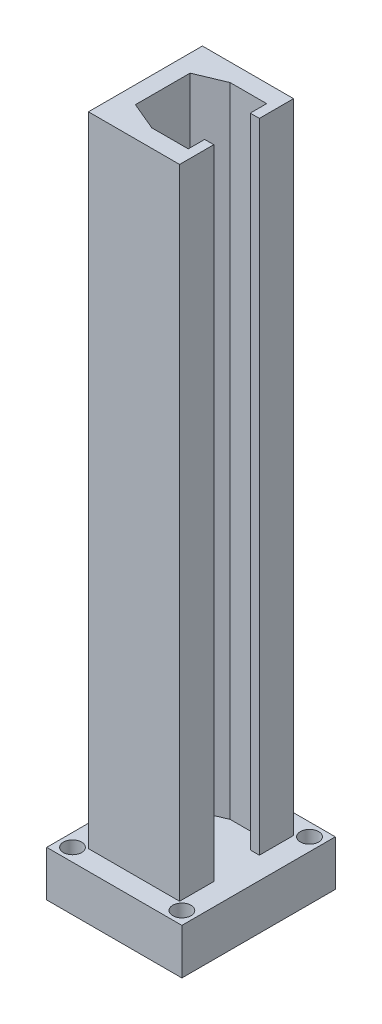
ISO-10303-21;
HEADER;
FILE_DESCRIPTION(('STEP AP214'),'2;1');
FILE_NAME('part.step','',(''),(''),'','','');
FILE_SCHEMA(('AUTOMOTIVE_DESIGN { 1 0 10303 214 1 1 1 1 }'));
ENDSEC;
DATA;
#1=APPLICATION_CONTEXT('core data for automotive mechanical design processes');
#2=APPLICATION_PROTOCOL_DEFINITION('international standard','automotive_design',2000,#1);
#3=PRODUCT_CONTEXT('',#1,'mechanical');
#4=PRODUCT('Part','Part','',(#3));
#5=PRODUCT_RELATED_PRODUCT_CATEGORY('part','',(#4));
#6=PRODUCT_DEFINITION_FORMATION('','',#4);
#7=PRODUCT_DEFINITION_CONTEXT('part definition',#1,'design');
#8=PRODUCT_DEFINITION('design','',#6,#7);
#9=PRODUCT_DEFINITION_SHAPE('','',#8);
#10=(LENGTH_UNIT() NAMED_UNIT(*) SI_UNIT(.MILLI.,.METRE.));
#11=(NAMED_UNIT(*) PLANE_ANGLE_UNIT() SI_UNIT($,.RADIAN.));
#12=(NAMED_UNIT(*) SI_UNIT($,.STERADIAN.) SOLID_ANGLE_UNIT());
#13=UNCERTAINTY_MEASURE_WITH_UNIT(LENGTH_MEASURE(1.E-05),#10,'distance_accuracy_value','');
#14=(GEOMETRIC_REPRESENTATION_CONTEXT(3) GLOBAL_UNCERTAINTY_ASSIGNED_CONTEXT((#13)) GLOBAL_UNIT_ASSIGNED_CONTEXT((#10,
#11,#12)) REPRESENTATION_CONTEXT('',''));
#15=CARTESIAN_POINT('',(0.,0.,0.));
#16=DIRECTION('',(0.,0.,1.));
#17=DIRECTION('',(1.,0.,0.));
#18=AXIS2_PLACEMENT_3D('',#15,#16,#17);
#19=CARTESIAN_POINT('',(-3.0670796460177,150.,-7.31380530973452));
#20=DIRECTION('',(0.386726676250674,0.,0.922194381828531));
#21=DIRECTION('',(0.922194381828531,0.,-0.386726676250674));
#22=AXIS2_PLACEMENT_3D('',#19,#20,#21);
#23=PLANE('',#22);
#24=DIRECTION('',(0.,-1.,0.));
#25=VECTOR('',#24,1.);
#26=CARTESIAN_POINT('',(-6.2,150.,-6.00000000000001));
#27=LINE('',#26,#25);
#28=CARTESIAN_POINT('',(-6.2,150.,-6.00000000000001));
#29=VERTEX_POINT('',#28);
#30=CARTESIAN_POINT('',(-6.2,10.,-6.00000000000001));
#31=VERTEX_POINT('',#30);
#32=EDGE_CURVE('E61',#29,#31,#27,.T.);
#33=ORIENTED_EDGE('',*,*,#32,.T.);
#34=DIRECTION('',(0.922194381828531,0.,-0.386726676250674));
#35=VECTOR('',#34,1.);
#36=CARTESIAN_POINT('',(-3.0670796460177,10.,-7.31380530973452));
#37=LINE('',#36,#35);
#38=CARTESIAN_POINT('',(0.,10.,-8.6));
#39=VERTEX_POINT('',#38);
#40=EDGE_CURVE('E55',#31,#39,#37,.T.);
#41=ORIENTED_EDGE('',*,*,#40,.T.);
#42=DIRECTION('',(0.,-1.,0.));
#43=VECTOR('',#42,1.);
#44=CARTESIAN_POINT('',(0.,150.,-8.6));
#45=LINE('',#44,#43);
#46=CARTESIAN_POINT('',(0.,150.,-8.6));
#47=VERTEX_POINT('',#46);
#48=EDGE_CURVE('E48',#47,#39,#45,.T.);
#49=ORIENTED_EDGE('',*,*,#48,.F.);
#50=DIRECTION('',(-0.922194381828531,0.,0.386726676250674));
#51=VECTOR('',#50,1.);
#52=CARTESIAN_POINT('',(-3.0670796460177,150.,-7.31380530973452));
#53=LINE('',#52,#51);
#54=EDGE_CURVE('E226',#47,#29,#53,.T.);
#55=ORIENTED_EDGE('',*,*,#54,.T.);
#56=EDGE_LOOP('',(#33,#41,#49,#55));
#57=FACE_BOUND('',#56,.T.);
#58=ADVANCED_FACE('F41',(#57),#23,.T.);
#59=CARTESIAN_POINT('',(0.,150.,-8.6));
#60=DIRECTION('',(0.,0.,-1.));
#61=DIRECTION('',(-1.,0.,0.));
#62=AXIS2_PLACEMENT_3D('',#59,#60,#61);
#63=PLANE('',#62);
#64=DIRECTION('',(-1.,0.,0.));
#65=VECTOR('',#64,1.);
#66=CARTESIAN_POINT('',(0.,10.,-8.6));
#67=LINE('',#66,#65);
#68=CARTESIAN_POINT('',(8.,10.,-8.6));
#69=VERTEX_POINT('',#68);
#70=EDGE_CURVE('E223',#69,#39,#67,.T.);
#71=ORIENTED_EDGE('',*,*,#70,.F.);
#72=DIRECTION('',(0.,-1.,0.));
#73=VECTOR('',#72,1.);
#74=CARTESIAN_POINT('',(8.,150.,-8.6));
#75=LINE('',#74,#73);
#76=CARTESIAN_POINT('',(8.,150.,-8.6));
#77=VERTEX_POINT('',#76);
#78=EDGE_CURVE('E292',#77,#69,#75,.T.);
#79=ORIENTED_EDGE('',*,*,#78,.F.);
#80=DIRECTION('',(1.,0.,0.));
#81=VECTOR('',#80,1.);
#82=CARTESIAN_POINT('',(0.,150.,-8.6));
#83=LINE('',#82,#81);
#84=EDGE_CURVE('E228',#47,#77,#83,.T.);
#85=ORIENTED_EDGE('',*,*,#84,.F.);
#86=ORIENTED_EDGE('',*,*,#48,.T.);
#87=EDGE_LOOP('',(#71,#79,#85,#86));
#88=FACE_BOUND('',#87,.T.);
#89=ADVANCED_FACE('F298',(#88),#63,.F.);
#90=CARTESIAN_POINT('',(8.,150.,0.));
#91=DIRECTION('',(1.,0.,0.));
#92=DIRECTION('',(0.,0.,-1.));
#93=AXIS2_PLACEMENT_3D('',#90,#91,#92);
#94=PLANE('',#93);
#95=DIRECTION('',(0.,0.,-1.));
#96=VECTOR('',#95,1.);
#97=CARTESIAN_POINT('',(8.,10.,0.));
#98=LINE('',#97,#96);
#99=CARTESIAN_POINT('',(8.,10.,-5.));
#100=VERTEX_POINT('',#99);
#101=EDGE_CURVE('E221',#100,#69,#98,.T.);
#102=ORIENTED_EDGE('',*,*,#101,.F.);
#103=DIRECTION('',(0.,-1.,0.));
#104=VECTOR('',#103,1.);
#105=CARTESIAN_POINT('',(8.,150.,-5.));
#106=LINE('',#105,#104);
#107=CARTESIAN_POINT('',(8.,150.,-5.));
#108=VERTEX_POINT('',#107);
#109=EDGE_CURVE('E289',#108,#100,#106,.T.);
#110=ORIENTED_EDGE('',*,*,#109,.F.);
#111=DIRECTION('',(0.,0.,1.));
#112=VECTOR('',#111,1.);
#113=CARTESIAN_POINT('',(8.,150.,0.));
#114=LINE('',#113,#112);
#115=EDGE_CURVE('E230',#77,#108,#114,.T.);
#116=ORIENTED_EDGE('',*,*,#115,.F.);
#117=ORIENTED_EDGE('',*,*,#78,.T.);
#118=EDGE_LOOP('',(#102,#110,#116,#117));
#119=FACE_BOUND('',#118,.T.);
#120=ADVANCED_FACE('F350',(#119),#94,.F.);
#121=CARTESIAN_POINT('',(0.,150.,-5.));
#122=DIRECTION('',(0.,0.,-1.));
#123=DIRECTION('',(-1.,0.,0.));
#124=AXIS2_PLACEMENT_3D('',#121,#122,#123);
#125=PLANE('',#124);
#126=DIRECTION('',(-1.,0.,0.));
#127=VECTOR('',#126,1.);
#128=CARTESIAN_POINT('',(0.,10.,-5.));
#129=LINE('',#128,#127);
#130=CARTESIAN_POINT('',(10.,10.,-5.));
#131=VERTEX_POINT('',#130);
#132=EDGE_CURVE('E219',#131,#100,#129,.T.);
#133=ORIENTED_EDGE('',*,*,#132,.F.);
#134=DIRECTION('',(0.,-1.,0.));
#135=VECTOR('',#134,1.);
#136=CARTESIAN_POINT('',(10.,150.,-5.));
#137=LINE('',#136,#135);
#138=CARTESIAN_POINT('',(10.,150.,-5.));
#139=VERTEX_POINT('',#138);
#140=EDGE_CURVE('E286',#139,#131,#137,.T.);
#141=ORIENTED_EDGE('',*,*,#140,.F.);
#142=DIRECTION('',(1.,0.,0.));
#143=VECTOR('',#142,1.);
#144=CARTESIAN_POINT('',(0.,150.,-5.));
#145=LINE('',#144,#143);
#146=EDGE_CURVE('E232',#108,#139,#145,.T.);
#147=ORIENTED_EDGE('',*,*,#146,.F.);
#148=ORIENTED_EDGE('',*,*,#109,.T.);
#149=EDGE_LOOP('',(#133,#141,#147,#148));
#150=FACE_BOUND('',#149,.T.);
#151=ADVANCED_FACE('F346',(#150),#125,.F.);
#152=CARTESIAN_POINT('',(10.,150.,0.));
#153=DIRECTION('',(-1.,0.,0.));
#154=DIRECTION('',(0.,0.,1.));
#155=AXIS2_PLACEMENT_3D('',#152,#153,#154);
#156=PLANE('',#155);
#157=DIRECTION('',(0.,0.,1.));
#158=VECTOR('',#157,1.);
#159=CARTESIAN_POINT('',(10.,10.,0.));
#160=LINE('',#159,#158);
#161=CARTESIAN_POINT('',(10.,10.,-12.5));
#162=VERTEX_POINT('',#161);
#163=EDGE_CURVE('E217',#162,#131,#160,.T.);
#164=ORIENTED_EDGE('',*,*,#163,.F.);
#165=DIRECTION('',(0.,-1.,0.));
#166=VECTOR('',#165,1.);
#167=CARTESIAN_POINT('',(10.,150.,-12.5));
#168=LINE('',#167,#166);
#169=CARTESIAN_POINT('',(10.,150.,-12.5));
#170=VERTEX_POINT('',#169);
#171=EDGE_CURVE('E283',#170,#162,#168,.T.);
#172=ORIENTED_EDGE('',*,*,#171,.F.);
#173=DIRECTION('',(0.,0.,-1.));
#174=VECTOR('',#173,1.);
#175=CARTESIAN_POINT('',(10.,150.,0.));
#176=LINE('',#175,#174);
#177=EDGE_CURVE('E234',#139,#170,#176,.T.);
#178=ORIENTED_EDGE('',*,*,#177,.F.);
#179=ORIENTED_EDGE('',*,*,#140,.T.);
#180=EDGE_LOOP('',(#164,#172,#178,#179));
#181=FACE_BOUND('',#180,.T.);
#182=ADVANCED_FACE('F342',(#181),#156,.F.);
#183=CARTESIAN_POINT('',(0.,150.,-12.5));
#184=DIRECTION('',(0.,0.,-1.));
#185=DIRECTION('',(-1.,0.,0.));
#186=AXIS2_PLACEMENT_3D('',#183,#184,#185);
#187=PLANE('',#186);
#188=ORIENTED_EDGE('',*,*,#171,.T.);
#189=DIRECTION('',(-1.,0.,0.));
#190=VECTOR('',#189,1.);
#191=CARTESIAN_POINT('',(0.,10.,-12.5));
#192=LINE('',#191,#190);
#193=CARTESIAN_POINT('',(-10.,10.,-12.5));
#194=VERTEX_POINT('',#193);
#195=EDGE_CURVE('E214',#162,#194,#192,.T.);
#196=ORIENTED_EDGE('',*,*,#195,.T.);
#197=DIRECTION('',(0.,-1.,0.));
#198=VECTOR('',#197,1.);
#199=CARTESIAN_POINT('',(-10.,150.,-12.5));
#200=LINE('',#199,#198);
#201=CARTESIAN_POINT('',(-10.,150.,-12.5));
#202=VERTEX_POINT('',#201);
#203=EDGE_CURVE('E280',#202,#194,#200,.T.);
#204=ORIENTED_EDGE('',*,*,#203,.F.);
#205=DIRECTION('',(1.,0.,0.));
#206=VECTOR('',#205,1.);
#207=CARTESIAN_POINT('',(0.,150.,-12.5));
#208=LINE('',#207,#206);
#209=EDGE_CURVE('E236',#202,#170,#208,.T.);
#210=ORIENTED_EDGE('',*,*,#209,.T.);
#211=EDGE_LOOP('',(#188,#196,#204,#210));
#212=FACE_BOUND('',#211,.T.);
#213=ADVANCED_FACE('F335',(#212),#187,.T.);
#214=CARTESIAN_POINT('',(-10.,150.,0.));
#215=DIRECTION('',(-1.,0.,0.));
#216=DIRECTION('',(0.,0.,1.));
#217=AXIS2_PLACEMENT_3D('',#214,#215,#216);
#218=PLANE('',#217);
#219=ORIENTED_EDGE('',*,*,#203,.T.);
#220=DIRECTION('',(0.,0.,1.));
#221=VECTOR('',#220,1.);
#222=CARTESIAN_POINT('',(-10.,10.,0.));
#223=LINE('',#222,#221);
#224=CARTESIAN_POINT('',(-10.,10.,12.5));
#225=VERTEX_POINT('',#224);
#226=EDGE_CURVE('E211',#194,#225,#223,.T.);
#227=ORIENTED_EDGE('',*,*,#226,.T.);
#228=DIRECTION('',(0.,-1.,0.));
#229=VECTOR('',#228,1.);
#230=CARTESIAN_POINT('',(-10.,150.,12.5));
#231=LINE('',#230,#229);
#232=CARTESIAN_POINT('',(-10.,150.,12.5));
#233=VERTEX_POINT('',#232);
#234=EDGE_CURVE('E277',#233,#225,#231,.T.);
#235=ORIENTED_EDGE('',*,*,#234,.F.);
#236=DIRECTION('',(0.,0.,-1.));
#237=VECTOR('',#236,1.);
#238=CARTESIAN_POINT('',(-10.,150.,0.));
#239=LINE('',#238,#237);
#240=EDGE_CURVE('E240',#233,#202,#239,.T.);
#241=ORIENTED_EDGE('',*,*,#240,.T.);
#242=EDGE_LOOP('',(#219,#227,#235,#241));
#243=FACE_BOUND('',#242,.T.);
#244=ADVANCED_FACE('F332',(#243),#218,.T.);
#245=CARTESIAN_POINT('',(0.,150.,12.5));
#246=DIRECTION('',(0.,0.,-1.));
#247=DIRECTION('',(-1.,0.,0.));
#248=AXIS2_PLACEMENT_3D('',#245,#246,#247);
#249=PLANE('',#248);
#250=DIRECTION('',(-1.,0.,0.));
#251=VECTOR('',#250,1.);
#252=CARTESIAN_POINT('',(0.,10.,12.5));
#253=LINE('',#252,#251);
#254=CARTESIAN_POINT('',(10.,10.,12.5));
#255=VERTEX_POINT('',#254);
#256=EDGE_CURVE('E209',#255,#225,#253,.T.);
#257=ORIENTED_EDGE('',*,*,#256,.F.);
#258=DIRECTION('',(0.,-1.,0.));
#259=VECTOR('',#258,1.);
#260=CARTESIAN_POINT('',(10.,150.,12.5));
#261=LINE('',#260,#259);
#262=CARTESIAN_POINT('',(10.,150.,12.5));
#263=VERTEX_POINT('',#262);
#264=EDGE_CURVE('E274',#263,#255,#261,.T.);
#265=ORIENTED_EDGE('',*,*,#264,.F.);
#266=DIRECTION('',(1.,0.,0.));
#267=VECTOR('',#266,1.);
#268=CARTESIAN_POINT('',(0.,150.,12.5));
#269=LINE('',#268,#267);
#270=EDGE_CURVE('E243',#233,#263,#269,.T.);
#271=ORIENTED_EDGE('',*,*,#270,.F.);
#272=ORIENTED_EDGE('',*,*,#234,.T.);
#273=EDGE_LOOP('',(#257,#265,#271,#272));
#274=FACE_BOUND('',#273,.T.);
#275=ADVANCED_FACE('F329',(#274),#249,.F.);
#276=DIRECTION('',(0.,0.,1.));
#277=VECTOR('',#276,1.);
#278=CARTESIAN_POINT('',(10.,10.,0.));
#279=LINE('',#278,#277);
#280=CARTESIAN_POINT('',(10.,10.,5.));
#281=VERTEX_POINT('',#280);
#282=EDGE_CURVE('E207',#281,#255,#279,.T.);
#283=ORIENTED_EDGE('',*,*,#282,.F.);
#284=DIRECTION('',(0.,-1.,0.));
#285=VECTOR('',#284,1.);
#286=CARTESIAN_POINT('',(10.,150.,5.));
#287=LINE('',#286,#285);
#288=CARTESIAN_POINT('',(10.,150.,5.));
#289=VERTEX_POINT('',#288);
#290=EDGE_CURVE('E271',#289,#281,#287,.T.);
#291=ORIENTED_EDGE('',*,*,#290,.F.);
#292=EDGE_CURVE('E237',#263,#289,#176,.T.);
#293=ORIENTED_EDGE('',*,*,#292,.F.);
#294=ORIENTED_EDGE('',*,*,#264,.T.);
#295=EDGE_LOOP('',(#283,#291,#293,#294));
#296=FACE_BOUND('',#295,.T.);
#297=ADVANCED_FACE('F325',(#296),#156,.F.);
#298=CARTESIAN_POINT('',(0.,150.,5.));
#299=DIRECTION('',(0.,0.,1.));
#300=DIRECTION('',(1.,0.,0.));
#301=AXIS2_PLACEMENT_3D('',#298,#299,#300);
#302=PLANE('',#301);
#303=DIRECTION('',(1.,0.,0.));
#304=VECTOR('',#303,1.);
#305=CARTESIAN_POINT('',(0.,10.,5.));
#306=LINE('',#305,#304);
#307=CARTESIAN_POINT('',(8.,10.,5.));
#308=VERTEX_POINT('',#307);
#309=EDGE_CURVE('E205',#308,#281,#306,.T.);
#310=ORIENTED_EDGE('',*,*,#309,.F.);
#311=DIRECTION('',(0.,-1.,0.));
#312=VECTOR('',#311,1.);
#313=CARTESIAN_POINT('',(8.,150.,5.));
#314=LINE('',#313,#312);
#315=CARTESIAN_POINT('',(8.,150.,5.));
#316=VERTEX_POINT('',#315);
#317=EDGE_CURVE('E268',#316,#308,#314,.T.);
#318=ORIENTED_EDGE('',*,*,#317,.F.);
#319=DIRECTION('',(-1.,0.,0.));
#320=VECTOR('',#319,1.);
#321=CARTESIAN_POINT('',(0.,150.,5.));
#322=LINE('',#321,#320);
#323=EDGE_CURVE('E245',#289,#316,#322,.T.);
#324=ORIENTED_EDGE('',*,*,#323,.F.);
#325=ORIENTED_EDGE('',*,*,#290,.T.);
#326=EDGE_LOOP('',(#310,#318,#324,#325));
#327=FACE_BOUND('',#326,.T.);
#328=ADVANCED_FACE('F321',(#327),#302,.F.);
#329=CARTESIAN_POINT('',(8.,150.,0.));
#330=DIRECTION('',(-1.,0.,0.));
#331=DIRECTION('',(0.,0.,1.));
#332=AXIS2_PLACEMENT_3D('',#329,#330,#331);
#333=PLANE('',#332);
#334=ORIENTED_EDGE('',*,*,#317,.T.);
#335=DIRECTION('',(0.,0.,1.));
#336=VECTOR('',#335,1.);
#337=CARTESIAN_POINT('',(8.,10.,0.));
#338=LINE('',#337,#336);
#339=CARTESIAN_POINT('',(8.,10.,8.6));
#340=VERTEX_POINT('',#339);
#341=EDGE_CURVE('E202',#308,#340,#338,.T.);
#342=ORIENTED_EDGE('',*,*,#341,.T.);
#343=DIRECTION('',(0.,-1.,0.));
#344=VECTOR('',#343,1.);
#345=CARTESIAN_POINT('',(8.,150.,8.6));
#346=LINE('',#345,#344);
#347=CARTESIAN_POINT('',(8.,150.,8.6));
#348=VERTEX_POINT('',#347);
#349=EDGE_CURVE('E265',#348,#340,#346,.T.);
#350=ORIENTED_EDGE('',*,*,#349,.F.);
#351=DIRECTION('',(0.,0.,-1.));
#352=VECTOR('',#351,1.);
#353=CARTESIAN_POINT('',(8.,150.,0.));
#354=LINE('',#353,#352);
#355=EDGE_CURVE('E247',#348,#316,#354,.T.);
#356=ORIENTED_EDGE('',*,*,#355,.T.);
#357=EDGE_LOOP('',(#334,#342,#350,#356));
#358=FACE_BOUND('',#357,.T.);
#359=ADVANCED_FACE('F314',(#358),#333,.T.);
#360=CARTESIAN_POINT('',(0.,150.,8.6));
#361=DIRECTION('',(0.,0.,-1.));
#362=DIRECTION('',(-1.,0.,0.));
#363=AXIS2_PLACEMENT_3D('',#360,#361,#362);
#364=PLANE('',#363);
#365=ORIENTED_EDGE('',*,*,#349,.T.);
#366=DIRECTION('',(-1.,0.,0.));
#367=VECTOR('',#366,1.);
#368=CARTESIAN_POINT('',(0.,10.,8.6));
#369=LINE('',#368,#367);
#370=CARTESIAN_POINT('',(0.,10.,8.6));
#371=VERTEX_POINT('',#370);
#372=EDGE_CURVE('E194',#340,#371,#369,.T.);
#373=ORIENTED_EDGE('',*,*,#372,.T.);
#374=DIRECTION('',(0.,-1.,0.));
#375=VECTOR('',#374,1.);
#376=CARTESIAN_POINT('',(0.,150.,8.6));
#377=LINE('',#376,#375);
#378=CARTESIAN_POINT('',(0.,150.,8.6));
#379=VERTEX_POINT('',#378);
#380=EDGE_CURVE('E262',#379,#371,#377,.T.);
#381=ORIENTED_EDGE('',*,*,#380,.F.);
#382=DIRECTION('',(1.,0.,0.));
#383=VECTOR('',#382,1.);
#384=CARTESIAN_POINT('',(0.,150.,8.6));
#385=LINE('',#384,#383);
#386=EDGE_CURVE('E250',#379,#348,#385,.T.);
#387=ORIENTED_EDGE('',*,*,#386,.T.);
#388=EDGE_LOOP('',(#365,#373,#381,#387));
#389=FACE_BOUND('',#388,.T.);
#390=ADVANCED_FACE('F311',(#389),#364,.T.);
#391=CARTESIAN_POINT('',(-3.0670796460177,150.,7.3138053097345));
#392=DIRECTION('',(0.386726676250675,0.,-0.922194381828531));
#393=DIRECTION('',(-0.922194381828531,0.,-0.386726676250675));
#394=AXIS2_PLACEMENT_3D('',#391,#392,#393);
#395=PLANE('',#394);
#396=ORIENTED_EDGE('',*,*,#380,.T.);
#397=DIRECTION('',(-0.922194381828531,0.,-0.386726676250675));
#398=VECTOR('',#397,1.);
#399=CARTESIAN_POINT('',(-3.0670796460177,10.,7.3138053097345));
#400=LINE('',#399,#398);
#401=CARTESIAN_POINT('',(-6.2,10.,5.99999999999999));
#402=VERTEX_POINT('',#401);
#403=EDGE_CURVE('E191',#371,#402,#400,.T.);
#404=ORIENTED_EDGE('',*,*,#403,.T.);
#405=DIRECTION('',(0.,-1.,0.));
#406=VECTOR('',#405,1.);
#407=CARTESIAN_POINT('',(-6.2,150.,5.99999999999999));
#408=LINE('',#407,#406);
#409=CARTESIAN_POINT('',(-6.2,150.,5.99999999999999));
#410=VERTEX_POINT('',#409);
#411=EDGE_CURVE('E259',#410,#402,#408,.T.);
#412=ORIENTED_EDGE('',*,*,#411,.F.);
#413=DIRECTION('',(0.922194381828531,0.,0.386726676250675));
#414=VECTOR('',#413,1.);
#415=CARTESIAN_POINT('',(-3.0670796460177,150.,7.3138053097345));
#416=LINE('',#415,#414);
#417=EDGE_CURVE('E253',#410,#379,#416,.T.);
#418=ORIENTED_EDGE('',*,*,#417,.T.);
#419=EDGE_LOOP('',(#396,#404,#412,#418));
#420=FACE_BOUND('',#419,.T.);
#421=ADVANCED_FACE('F309',(#420),#395,.T.);
#422=CARTESIAN_POINT('',(-6.2,150.,0.));
#423=DIRECTION('',(1.,0.,0.));
#424=DIRECTION('',(0.,0.,-1.));
#425=AXIS2_PLACEMENT_3D('',#422,#423,#424);
#426=PLANE('',#425);
#427=ORIENTED_EDGE('',*,*,#411,.T.);
#428=DIRECTION('',(0.,0.,-1.));
#429=VECTOR('',#428,1.);
#430=CARTESIAN_POINT('',(-6.2,10.,0.));
#431=LINE('',#430,#429);
#432=EDGE_CURVE('E11',#402,#31,#431,.T.);
#433=ORIENTED_EDGE('',*,*,#432,.T.);
#434=ORIENTED_EDGE('',*,*,#32,.F.);
#435=DIRECTION('',(0.,0.,1.));
#436=VECTOR('',#435,1.);
#437=CARTESIAN_POINT('',(-6.2,150.,0.));
#438=LINE('',#437,#436);
#439=EDGE_CURVE('E256',#29,#410,#438,.T.);
#440=ORIENTED_EDGE('',*,*,#439,.T.);
#441=EDGE_LOOP('',(#427,#433,#434,#440));
#442=FACE_BOUND('',#441,.T.);
#443=ADVANCED_FACE('F307',(#442),#426,.T.);
#444=CARTESIAN_POINT('',(0.,150.,0.));
#445=DIRECTION('',(0.,1.,0.));
#446=DIRECTION('',(0.,0.,1.));
#447=AXIS2_PLACEMENT_3D('',#444,#445,#446);
#448=PLANE('',#447);
#449=ORIENTED_EDGE('',*,*,#54,.F.);
#450=ORIENTED_EDGE('',*,*,#84,.T.);
#451=ORIENTED_EDGE('',*,*,#115,.T.);
#452=ORIENTED_EDGE('',*,*,#146,.T.);
#453=ORIENTED_EDGE('',*,*,#177,.T.);
#454=ORIENTED_EDGE('',*,*,#209,.F.);
#455=ORIENTED_EDGE('',*,*,#240,.F.);
#456=ORIENTED_EDGE('',*,*,#270,.T.);
#457=ORIENTED_EDGE('',*,*,#292,.T.);
#458=ORIENTED_EDGE('',*,*,#323,.T.);
#459=ORIENTED_EDGE('',*,*,#355,.F.);
#460=ORIENTED_EDGE('',*,*,#386,.F.);
#461=ORIENTED_EDGE('',*,*,#417,.F.);
#462=ORIENTED_EDGE('',*,*,#439,.F.);
#463=EDGE_LOOP('',(#449,#450,#451,#452,#453,#454,#455,#456,#457,#458,#459,#460,#461,#462));
#464=FACE_BOUND('',#463,.T.);
#465=ADVANCED_FACE('F305',(#464),#448,.T.);
#466=CARTESIAN_POINT('',(0.,10.,0.));
#467=DIRECTION('',(0.,-1.,0.));
#468=DIRECTION('',(0.,0.,-1.));
#469=AXIS2_PLACEMENT_3D('',#466,#467,#468);
#470=PLANE('',#469);
#471=ORIENTED_EDGE('',*,*,#40,.F.);
#472=ORIENTED_EDGE('',*,*,#432,.F.);
#473=ORIENTED_EDGE('',*,*,#403,.F.);
#474=ORIENTED_EDGE('',*,*,#372,.F.);
#475=ORIENTED_EDGE('',*,*,#341,.F.);
#476=ORIENTED_EDGE('',*,*,#309,.T.);
#477=ORIENTED_EDGE('',*,*,#282,.T.);
#478=ORIENTED_EDGE('',*,*,#256,.T.);
#479=ORIENTED_EDGE('',*,*,#226,.F.);
#480=ORIENTED_EDGE('',*,*,#195,.F.);
#481=ORIENTED_EDGE('',*,*,#163,.T.);
#482=ORIENTED_EDGE('',*,*,#132,.T.);
#483=ORIENTED_EDGE('',*,*,#101,.T.);
#484=ORIENTED_EDGE('',*,*,#70,.T.);
#485=EDGE_LOOP('',(#471,#472,#473,#474,#475,#476,#477,#478,#479,#480,#481,#482,#483,#484));
#486=FACE_BOUND('',#485,.T.);
#487=DIRECTION('',(-1.,0.,0.));
#488=VECTOR('',#487,1.);
#489=CARTESIAN_POINT('',(14.8284271247462,10.,-16.8284271247462));
#490=LINE('',#489,#488);
#491=CARTESIAN_POINT('',(14.8284271247462,10.,-16.8284271247462));
#492=VERTEX_POINT('',#491);
#493=CARTESIAN_POINT('',(-14.8284271247462,10.,-16.8284271247462));
#494=VERTEX_POINT('',#493);
#495=EDGE_CURVE('E176',#492,#494,#490,.T.);
#496=ORIENTED_EDGE('',*,*,#495,.T.);
#497=DIRECTION('',(0.,0.,1.));
#498=VECTOR('',#497,1.);
#499=CARTESIAN_POINT('',(-14.8284271247462,10.,16.8284271247463));
#500=LINE('',#499,#498);
#501=CARTESIAN_POINT('',(-14.8284271247462,10.,16.8284271247463));
#502=VERTEX_POINT('',#501);
#503=EDGE_CURVE('E165',#494,#502,#500,.T.);
#504=ORIENTED_EDGE('',*,*,#503,.T.);
#505=DIRECTION('',(1.,0.,0.));
#506=VECTOR('',#505,1.);
#507=CARTESIAN_POINT('',(14.8284271247462,10.,16.8284271247462));
#508=LINE('',#507,#506);
#509=CARTESIAN_POINT('',(14.8284271247462,10.,16.8284271247462));
#510=VERTEX_POINT('',#509);
#511=EDGE_CURVE('E175',#502,#510,#508,.T.);
#512=ORIENTED_EDGE('',*,*,#511,.T.);
#513=DIRECTION('',(0.,0.,-1.));
#514=VECTOR('',#513,1.);
#515=CARTESIAN_POINT('',(14.8284271247462,10.,16.8284271247462));
#516=LINE('',#515,#514);
#517=EDGE_CURVE('E182',#510,#492,#516,.T.);
#518=ORIENTED_EDGE('',*,*,#517,.T.);
#519=EDGE_LOOP('',(#496,#504,#512,#518));
#520=FACE_BOUND('',#519,.T.);
#521=CARTESIAN_POINT('',(-12.,10.,-14.));
#522=DIRECTION('',(0.,1.,0.));
#523=DIRECTION('',(0.,0.,1.));
#524=AXIS2_PLACEMENT_3D('',#521,#522,#523);
#525=CIRCLE('',#524,2.);
#526=CARTESIAN_POINT('',(-12.,10.,-12.));
#527=VERTEX_POINT('',#526);
#528=EDGE_CURVE('E536',#527,#527,#525,.T.);
#529=ORIENTED_EDGE('',*,*,#528,.F.);
#530=EDGE_LOOP('',(#529));
#531=FACE_BOUND('',#530,.T.);
#532=CARTESIAN_POINT('',(-12.,10.,14.));
#533=DIRECTION('',(0.,1.,0.));
#534=DIRECTION('',(0.,0.,1.));
#535=AXIS2_PLACEMENT_3D('',#532,#533,#534);
#536=CIRCLE('',#535,2.);
#537=CARTESIAN_POINT('',(-12.,10.,16.));
#538=VERTEX_POINT('',#537);
#539=EDGE_CURVE('E530',#538,#538,#536,.T.);
#540=ORIENTED_EDGE('',*,*,#539,.F.);
#541=EDGE_LOOP('',(#540));
#542=FACE_BOUND('',#541,.T.);
#543=CARTESIAN_POINT('',(12.,10.,-14.));
#544=DIRECTION('',(0.,1.,0.));
#545=DIRECTION('',(0.,0.,-1.));
#546=AXIS2_PLACEMENT_3D('',#543,#544,#545);
#547=CIRCLE('',#546,2.);
#548=CARTESIAN_POINT('',(12.,10.,-16.));
#549=VERTEX_POINT('',#548);
#550=EDGE_CURVE('E524',#549,#549,#547,.T.);
#551=ORIENTED_EDGE('',*,*,#550,.F.);
#552=EDGE_LOOP('',(#551));
#553=FACE_BOUND('',#552,.T.);
#554=CARTESIAN_POINT('',(12.,10.,14.));
#555=DIRECTION('',(0.,1.,0.));
#556=DIRECTION('',(0.,0.,-1.));
#557=AXIS2_PLACEMENT_3D('',#554,#555,#556);
#558=CIRCLE('',#557,2.);
#559=CARTESIAN_POINT('',(12.,10.,12.));
#560=VERTEX_POINT('',#559);
#561=EDGE_CURVE('E515',#560,#560,#558,.T.);
#562=ORIENTED_EDGE('',*,*,#561,.F.);
#563=EDGE_LOOP('',(#562));
#564=FACE_BOUND('',#563,.T.);
#565=ADVANCED_FACE('F179',(#486,#520,#531,#542,#553,#564),#470,.F.);
#566=CARTESIAN_POINT('',(14.8284271247462,10.,-16.8284271247462));
#567=DIRECTION('',(0.,0.,1.));
#568=DIRECTION('',(1.,0.,0.));
#569=AXIS2_PLACEMENT_3D('',#566,#567,#568);
#570=PLANE('',#569);
#571=DIRECTION('',(-1.,0.,0.));
#572=VECTOR('',#571,1.);
#573=CARTESIAN_POINT('',(14.8284271247462,0.,-16.8284271247462));
#574=LINE('',#573,#572);
#575=CARTESIAN_POINT('',(14.8284271247462,0.,-16.8284271247462));
#576=VERTEX_POINT('',#575);
#577=CARTESIAN_POINT('',(-14.8284271247462,0.,-16.8284271247462));
#578=VERTEX_POINT('',#577);
#579=EDGE_CURVE('E190',#576,#578,#574,.T.);
#580=ORIENTED_EDGE('',*,*,#579,.T.);
#581=DIRECTION('',(0.,-1.,0.));
#582=VECTOR('',#581,1.);
#583=CARTESIAN_POINT('',(-14.8284271247462,10.,-16.8284271247462));
#584=LINE('',#583,#582);
#585=EDGE_CURVE('E169',#494,#578,#584,.T.);
#586=ORIENTED_EDGE('',*,*,#585,.F.);
#587=ORIENTED_EDGE('',*,*,#495,.F.);
#588=DIRECTION('',(0.,-1.,0.));
#589=VECTOR('',#588,1.);
#590=CARTESIAN_POINT('',(14.8284271247462,10.,-16.8284271247462));
#591=LINE('',#590,#589);
#592=EDGE_CURVE('E543',#492,#576,#591,.T.);
#593=ORIENTED_EDGE('',*,*,#592,.T.);
#594=EDGE_LOOP('',(#580,#586,#587,#593));
#595=FACE_BOUND('',#594,.T.);
#596=ADVANCED_FACE('F188',(#595),#570,.F.);
#597=CARTESIAN_POINT('',(-14.8284271247462,10.,16.8284271247463));
#598=DIRECTION('',(1.,0.,0.));
#599=DIRECTION('',(0.,0.,-1.));
#600=AXIS2_PLACEMENT_3D('',#597,#598,#599);
#601=PLANE('',#600);
#602=DIRECTION('',(0.,0.,1.));
#603=VECTOR('',#602,1.);
#604=CARTESIAN_POINT('',(-14.8284271247462,0.,16.8284271247463));
#605=LINE('',#604,#603);
#606=CARTESIAN_POINT('',(-14.8284271247462,0.,16.8284271247463));
#607=VERTEX_POINT('',#606);
#608=EDGE_CURVE('E545',#578,#607,#605,.T.);
#609=ORIENTED_EDGE('',*,*,#608,.T.);
#610=DIRECTION('',(0.,-1.,0.));
#611=VECTOR('',#610,1.);
#612=CARTESIAN_POINT('',(-14.8284271247462,10.,16.8284271247463));
#613=LINE('',#612,#611);
#614=EDGE_CURVE('E172',#502,#607,#613,.T.);
#615=ORIENTED_EDGE('',*,*,#614,.F.);
#616=ORIENTED_EDGE('',*,*,#503,.F.);
#617=ORIENTED_EDGE('',*,*,#585,.T.);
#618=EDGE_LOOP('',(#609,#615,#616,#617));
#619=FACE_BOUND('',#618,.T.);
#620=ADVANCED_FACE('F167',(#619),#601,.F.);
#621=CARTESIAN_POINT('',(14.8284271247462,10.,16.8284271247462));
#622=DIRECTION('',(0.,0.,-1.));
#623=DIRECTION('',(-1.,0.,0.));
#624=AXIS2_PLACEMENT_3D('',#621,#622,#623);
#625=PLANE('',#624);
#626=DIRECTION('',(1.,0.,0.));
#627=VECTOR('',#626,1.);
#628=CARTESIAN_POINT('',(14.8284271247462,0.,16.8284271247462));
#629=LINE('',#628,#627);
#630=CARTESIAN_POINT('',(14.8284271247462,0.,16.8284271247462));
#631=VERTEX_POINT('',#630);
#632=EDGE_CURVE('E547',#607,#631,#629,.T.);
#633=ORIENTED_EDGE('',*,*,#632,.T.);
#634=DIRECTION('',(0.,-1.,0.));
#635=VECTOR('',#634,1.);
#636=CARTESIAN_POINT('',(14.8284271247462,10.,16.8284271247462));
#637=LINE('',#636,#635);
#638=EDGE_CURVE('E196',#510,#631,#637,.T.);
#639=ORIENTED_EDGE('',*,*,#638,.F.);
#640=ORIENTED_EDGE('',*,*,#511,.F.);
#641=ORIENTED_EDGE('',*,*,#614,.T.);
#642=EDGE_LOOP('',(#633,#639,#640,#641));
#643=FACE_BOUND('',#642,.T.);
#644=ADVANCED_FACE('F488',(#643),#625,.F.);
#645=CARTESIAN_POINT('',(14.8284271247462,10.,16.8284271247462));
#646=DIRECTION('',(-1.,0.,0.));
#647=DIRECTION('',(0.,0.,1.));
#648=AXIS2_PLACEMENT_3D('',#645,#646,#647);
#649=PLANE('',#648);
#650=DIRECTION('',(0.,0.,-1.));
#651=VECTOR('',#650,1.);
#652=CARTESIAN_POINT('',(14.8284271247462,0.,16.8284271247462));
#653=LINE('',#652,#651);
#654=EDGE_CURVE('E186',#631,#576,#653,.T.);
#655=ORIENTED_EDGE('',*,*,#654,.T.);
#656=ORIENTED_EDGE('',*,*,#592,.F.);
#657=ORIENTED_EDGE('',*,*,#517,.F.);
#658=ORIENTED_EDGE('',*,*,#638,.T.);
#659=EDGE_LOOP('',(#655,#656,#657,#658));
#660=FACE_BOUND('',#659,.T.);
#661=ADVANCED_FACE('F491',(#660),#649,.F.);
#662=CARTESIAN_POINT('',(-12.,10.,-14.));
#663=DIRECTION('',(0.,-1.,0.));
#664=DIRECTION('',(0.,0.,-1.));
#665=AXIS2_PLACEMENT_3D('',#662,#663,#664);
#666=CYLINDRICAL_SURFACE('',#665,2.);
#667=ORIENTED_EDGE('',*,*,#528,.T.);
#668=EDGE_LOOP('',(#667));
#669=FACE_BOUND('',#668,.T.);
#670=CARTESIAN_POINT('',(-12.,0.,-14.));
#671=DIRECTION('',(0.,1.,0.));
#672=DIRECTION('',(0.,0.,1.));
#673=AXIS2_PLACEMENT_3D('',#670,#671,#672);
#674=CIRCLE('',#673,2.);
#675=CARTESIAN_POINT('',(-12.,0.,-12.));
#676=VERTEX_POINT('',#675);
#677=EDGE_CURVE('E533',#676,#676,#674,.T.);
#678=ORIENTED_EDGE('',*,*,#677,.F.);
#679=EDGE_LOOP('',(#678));
#680=FACE_BOUND('',#679,.T.);
#681=ADVANCED_FACE('F494',(#669,#680),#666,.F.);
#682=CARTESIAN_POINT('',(-12.,10.,14.));
#683=DIRECTION('',(0.,-1.,0.));
#684=DIRECTION('',(0.,0.,-1.));
#685=AXIS2_PLACEMENT_3D('',#682,#683,#684);
#686=CYLINDRICAL_SURFACE('',#685,2.);
#687=ORIENTED_EDGE('',*,*,#539,.T.);
#688=EDGE_LOOP('',(#687));
#689=FACE_BOUND('',#688,.T.);
#690=CARTESIAN_POINT('',(-12.,0.,14.));
#691=DIRECTION('',(0.,1.,0.));
#692=DIRECTION('',(0.,0.,1.));
#693=AXIS2_PLACEMENT_3D('',#690,#691,#692);
#694=CIRCLE('',#693,2.);
#695=CARTESIAN_POINT('',(-12.,0.,16.));
#696=VERTEX_POINT('',#695);
#697=EDGE_CURVE('E527',#696,#696,#694,.T.);
#698=ORIENTED_EDGE('',*,*,#697,.F.);
#699=EDGE_LOOP('',(#698));
#700=FACE_BOUND('',#699,.T.);
#701=ADVANCED_FACE('F499',(#689,#700),#686,.F.);
#702=CARTESIAN_POINT('',(12.,10.,-14.));
#703=DIRECTION('',(0.,-1.,0.));
#704=DIRECTION('',(0.,0.,-1.));
#705=AXIS2_PLACEMENT_3D('',#702,#703,#704);
#706=CYLINDRICAL_SURFACE('',#705,2.);
#707=ORIENTED_EDGE('',*,*,#550,.T.);
#708=EDGE_LOOP('',(#707));
#709=FACE_BOUND('',#708,.T.);
#710=CARTESIAN_POINT('',(12.,0.,-14.));
#711=DIRECTION('',(0.,1.,0.));
#712=DIRECTION('',(0.,0.,-1.));
#713=AXIS2_PLACEMENT_3D('',#710,#711,#712);
#714=CIRCLE('',#713,2.);
#715=CARTESIAN_POINT('',(12.,0.,-16.));
#716=VERTEX_POINT('',#715);
#717=EDGE_CURVE('E521',#716,#716,#714,.T.);
#718=ORIENTED_EDGE('',*,*,#717,.F.);
#719=EDGE_LOOP('',(#718));
#720=FACE_BOUND('',#719,.T.);
#721=ADVANCED_FACE('F503',(#709,#720),#706,.F.);
#722=CARTESIAN_POINT('',(12.,10.,14.));
#723=DIRECTION('',(0.,-1.,0.));
#724=DIRECTION('',(0.,0.,-1.));
#725=AXIS2_PLACEMENT_3D('',#722,#723,#724);
#726=CYLINDRICAL_SURFACE('',#725,2.);
#727=ORIENTED_EDGE('',*,*,#561,.T.);
#728=EDGE_LOOP('',(#727));
#729=FACE_BOUND('',#728,.T.);
#730=CARTESIAN_POINT('',(12.,0.,14.));
#731=DIRECTION('',(0.,1.,0.));
#732=DIRECTION('',(0.,0.,-1.));
#733=AXIS2_PLACEMENT_3D('',#730,#731,#732);
#734=CIRCLE('',#733,2.);
#735=CARTESIAN_POINT('',(12.,0.,12.));
#736=VERTEX_POINT('',#735);
#737=EDGE_CURVE('E518',#736,#736,#734,.T.);
#738=ORIENTED_EDGE('',*,*,#737,.F.);
#739=EDGE_LOOP('',(#738));
#740=FACE_BOUND('',#739,.T.);
#741=ADVANCED_FACE('F471',(#729,#740),#726,.F.);
#742=CARTESIAN_POINT('',(0.,0.,0.));
#743=DIRECTION('',(0.,1.,0.));
#744=DIRECTION('',(0.,0.,1.));
#745=AXIS2_PLACEMENT_3D('',#742,#743,#744);
#746=PLANE('',#745);
#747=ORIENTED_EDGE('',*,*,#717,.T.);
#748=EDGE_LOOP('',(#747));
#749=FACE_BOUND('',#748,.T.);
#750=ORIENTED_EDGE('',*,*,#677,.T.);
#751=EDGE_LOOP('',(#750));
#752=FACE_BOUND('',#751,.T.);
#753=ORIENTED_EDGE('',*,*,#579,.F.);
#754=ORIENTED_EDGE('',*,*,#654,.F.);
#755=ORIENTED_EDGE('',*,*,#632,.F.);
#756=ORIENTED_EDGE('',*,*,#608,.F.);
#757=EDGE_LOOP('',(#753,#754,#755,#756));
#758=FACE_BOUND('',#757,.T.);
#759=ORIENTED_EDGE('',*,*,#697,.T.);
#760=EDGE_LOOP('',(#759));
#761=FACE_BOUND('',#760,.T.);
#762=ORIENTED_EDGE('',*,*,#737,.T.);
#763=EDGE_LOOP('',(#762));
#764=FACE_BOUND('',#763,.T.);
#765=ADVANCED_FACE('F466',(#749,#752,#758,#761,#764),#746,.F.);
#766=CLOSED_SHELL('',(#58,#89,#120,#151,#182,#213,#244,#275,#297,#328,#359,#390,#421,#443,#465,
#565,#596,#620,#644,#661,#681,#701,#721,#741,#765));
#767=MANIFOLD_SOLID_BREP('B2',#766);
#768=ADVANCED_BREP_SHAPE_REPRESENTATION('',(#18,#767),#14);
#769=SHAPE_DEFINITION_REPRESENTATION(#9,#768);
ENDSEC;
END-ISO-10303-21;
